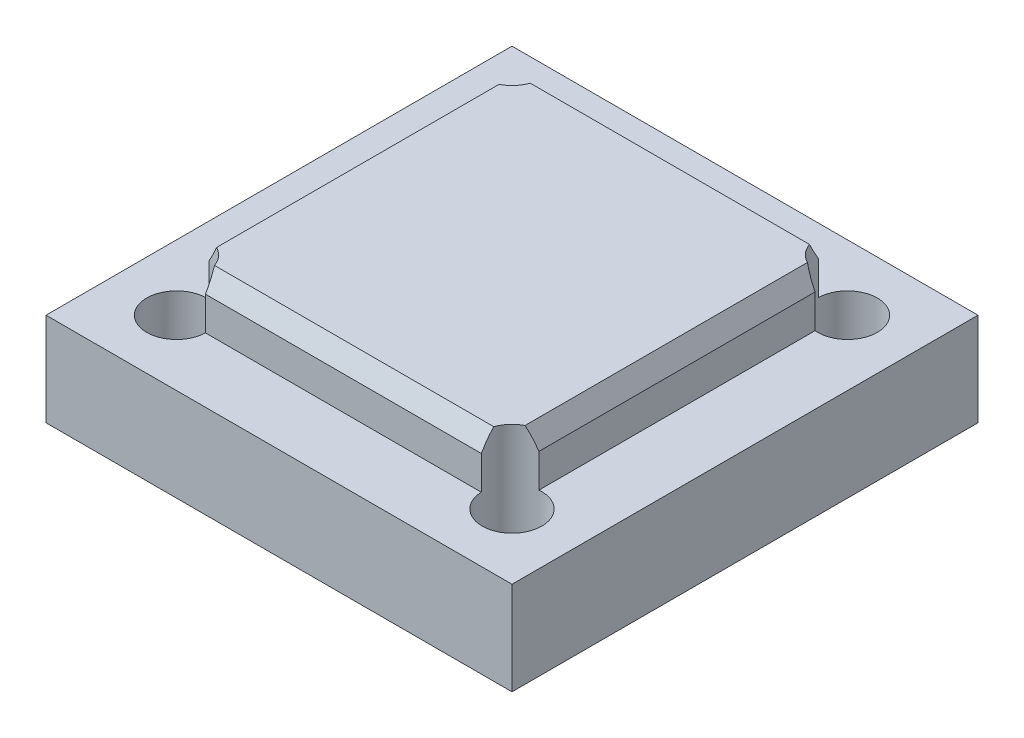
ISO-10303-21;
HEADER;
FILE_DESCRIPTION(('STEP AP214'),'2;1');
FILE_NAME('part.step','',(''),(''),'','','');
FILE_SCHEMA(('AUTOMOTIVE_DESIGN { 1 0 10303 214 1 1 1 1 }'));
ENDSEC;
DATA;
#1=APPLICATION_CONTEXT('core data for automotive mechanical design processes');
#2=APPLICATION_PROTOCOL_DEFINITION('international standard','automotive_design',2000,#1);
#3=PRODUCT_CONTEXT('',#1,'mechanical');
#4=PRODUCT('Part','Part','',(#3));
#5=PRODUCT_RELATED_PRODUCT_CATEGORY('part','',(#4));
#6=PRODUCT_DEFINITION_FORMATION('','',#4);
#7=PRODUCT_DEFINITION_CONTEXT('part definition',#1,'design');
#8=PRODUCT_DEFINITION('design','',#6,#7);
#9=PRODUCT_DEFINITION_SHAPE('','',#8);
#10=(LENGTH_UNIT() NAMED_UNIT(*) SI_UNIT(.MILLI.,.METRE.));
#11=(NAMED_UNIT(*) PLANE_ANGLE_UNIT() SI_UNIT($,.RADIAN.));
#12=(NAMED_UNIT(*) SI_UNIT($,.STERADIAN.) SOLID_ANGLE_UNIT());
#13=UNCERTAINTY_MEASURE_WITH_UNIT(LENGTH_MEASURE(1.E-05),#10,'distance_accuracy_value','');
#14=(GEOMETRIC_REPRESENTATION_CONTEXT(3) GLOBAL_UNCERTAINTY_ASSIGNED_CONTEXT((#13)) GLOBAL_UNIT_ASSIGNED_CONTEXT((#10,
#11,#12)) REPRESENTATION_CONTEXT('',''));
#15=CARTESIAN_POINT('',(0.,0.,0.));
#16=DIRECTION('',(0.,0.,1.));
#17=DIRECTION('',(1.,0.,0.));
#18=AXIS2_PLACEMENT_3D('',#15,#16,#17);
#19=CARTESIAN_POINT('',(0.,5.,0.));
#20=DIRECTION('',(0.,1.,0.));
#21=DIRECTION('',(0.,0.,1.));
#22=AXIS2_PLACEMENT_3D('',#19,#20,#21);
#23=PLANE('',#22);
#24=CARTESIAN_POINT('',(-9.,5.,9.));
#25=DIRECTION('',(0.,1.,0.));
#26=DIRECTION('',(0.,0.,1.));
#27=AXIS2_PLACEMENT_3D('',#24,#25,#26);
#28=CIRCLE('',#27,1.6);
#29=CARTESIAN_POINT('',(-8.84999999999999,5.,7.4070467677926));
#30=VERTEX_POINT('',#29);
#31=CARTESIAN_POINT('',(-7.40067118298047,5.,9.04633934668198));
#32=VERTEX_POINT('',#31);
#33=EDGE_CURVE('E283',#30,#32,#28,.T.);
#34=ORIENTED_EDGE('',*,*,#33,.F.);
#35=DIRECTION('',(0.,0.,1.));
#36=VECTOR('',#35,1.);
#37=CARTESIAN_POINT('',(-8.85,5.,-9.04633934668197));
#38=LINE('',#37,#36);
#39=CARTESIAN_POINT('',(-8.85,5.,-7.4070467677926));
#40=VERTEX_POINT('',#39);
#41=EDGE_CURVE('E300',#40,#30,#38,.T.);
#42=ORIENTED_EDGE('',*,*,#41,.F.);
#43=CARTESIAN_POINT('',(-9.,5.,-9.));
#44=DIRECTION('',(0.,1.,0.));
#45=DIRECTION('',(0.,0.,1.));
#46=AXIS2_PLACEMENT_3D('',#43,#44,#45);
#47=CIRCLE('',#46,1.6);
#48=CARTESIAN_POINT('',(-7.40067118298047,5.,-9.04633934668197));
#49=VERTEX_POINT('',#48);
#50=EDGE_CURVE('E173',#49,#40,#47,.T.);
#51=ORIENTED_EDGE('',*,*,#50,.F.);
#52=DIRECTION('',(-1.,0.,0.));
#53=VECTOR('',#52,1.);
#54=CARTESIAN_POINT('',(8.85,5.,-9.04633934668198));
#55=LINE('',#54,#53);
#56=CARTESIAN_POINT('',(7.40067118298047,5.,-9.04633934668198));
#57=VERTEX_POINT('',#56);
#58=EDGE_CURVE('E151',#57,#49,#55,.T.);
#59=ORIENTED_EDGE('',*,*,#58,.F.);
#60=CARTESIAN_POINT('',(9.,5.,-9.));
#61=DIRECTION('',(0.,1.,0.));
#62=DIRECTION('',(0.,0.,1.));
#63=AXIS2_PLACEMENT_3D('',#60,#61,#62);
#64=CIRCLE('',#63,1.6);
#65=CARTESIAN_POINT('',(8.85,5.,-7.4070467677926));
#66=VERTEX_POINT('',#65);
#67=EDGE_CURVE('E156',#66,#57,#64,.T.);
#68=ORIENTED_EDGE('',*,*,#67,.F.);
#69=DIRECTION('',(0.,0.,-1.));
#70=VECTOR('',#69,1.);
#71=CARTESIAN_POINT('',(8.85,5.,-9.04633934668198));
#72=LINE('',#71,#70);
#73=CARTESIAN_POINT('',(8.85,5.,7.4070467677926));
#74=VERTEX_POINT('',#73);
#75=EDGE_CURVE('E175',#74,#66,#72,.T.);
#76=ORIENTED_EDGE('',*,*,#75,.F.);
#77=CARTESIAN_POINT('',(9.,5.,9.));
#78=DIRECTION('',(0.,1.,0.));
#79=DIRECTION('',(0.,0.,1.));
#80=AXIS2_PLACEMENT_3D('',#77,#78,#79);
#81=CIRCLE('',#80,1.6);
#82=CARTESIAN_POINT('',(7.40067118298047,5.,9.04633934668198));
#83=VERTEX_POINT('',#82);
#84=EDGE_CURVE('E295',#83,#74,#81,.T.);
#85=ORIENTED_EDGE('',*,*,#84,.F.);
#86=DIRECTION('',(1.,0.,0.));
#87=VECTOR('',#86,1.);
#88=CARTESIAN_POINT('',(8.85,5.,9.04633934668198));
#89=LINE('',#88,#87);
#90=EDGE_CURVE('E180',#32,#83,#89,.T.);
#91=ORIENTED_EDGE('',*,*,#90,.F.);
#92=EDGE_LOOP('',(#34,#42,#51,#59,#68,#76,#85,#91));
#93=FACE_BOUND('',#92,.T.);
#94=DIRECTION('',(0.,0.,1.));
#95=VECTOR('',#94,1.);
#96=CARTESIAN_POINT('',(-12.5,5.,12.5));
#97=LINE('',#96,#95);
#98=CARTESIAN_POINT('',(-12.5,5.,-12.5));
#99=VERTEX_POINT('',#98);
#100=CARTESIAN_POINT('',(-12.5,5.,12.5));
#101=VERTEX_POINT('',#100);
#102=EDGE_CURVE('E184',#99,#101,#97,.T.);
#103=ORIENTED_EDGE('',*,*,#102,.T.);
#104=DIRECTION('',(1.,0.,0.));
#105=VECTOR('',#104,1.);
#106=CARTESIAN_POINT('',(12.5,5.,12.5));
#107=LINE('',#106,#105);
#108=CARTESIAN_POINT('',(12.5,5.,12.5));
#109=VERTEX_POINT('',#108);
#110=EDGE_CURVE('E187',#101,#109,#107,.T.);
#111=ORIENTED_EDGE('',*,*,#110,.T.);
#112=DIRECTION('',(0.,0.,-1.));
#113=VECTOR('',#112,1.);
#114=CARTESIAN_POINT('',(12.5,5.,12.5));
#115=LINE('',#114,#113);
#116=CARTESIAN_POINT('',(12.5,5.,-12.5));
#117=VERTEX_POINT('',#116);
#118=EDGE_CURVE('E190',#109,#117,#115,.T.);
#119=ORIENTED_EDGE('',*,*,#118,.T.);
#120=DIRECTION('',(-1.,0.,0.));
#121=VECTOR('',#120,1.);
#122=CARTESIAN_POINT('',(12.5,5.,-12.5));
#123=LINE('',#122,#121);
#124=EDGE_CURVE('E192',#117,#99,#123,.T.);
#125=ORIENTED_EDGE('',*,*,#124,.T.);
#126=EDGE_LOOP('',(#103,#111,#119,#125));
#127=FACE_BOUND('',#126,.T.);
#128=ADVANCED_FACE('F34',(#93,#127),#23,.T.);
#129=CARTESIAN_POINT('',(-12.5,5.,12.5));
#130=DIRECTION('',(1.,0.,0.));
#131=DIRECTION('',(0.,0.,-1.));
#132=AXIS2_PLACEMENT_3D('',#129,#130,#131);
#133=PLANE('',#132);
#134=DIRECTION('',(0.,0.,1.));
#135=VECTOR('',#134,1.);
#136=CARTESIAN_POINT('',(-12.5,0.,12.5));
#137=LINE('',#136,#135);
#138=CARTESIAN_POINT('',(-12.5,0.,-12.5));
#139=VERTEX_POINT('',#138);
#140=CARTESIAN_POINT('',(-12.5,0.,12.5));
#141=VERTEX_POINT('',#140);
#142=EDGE_CURVE('E174',#139,#141,#137,.T.);
#143=ORIENTED_EDGE('',*,*,#142,.T.);
#144=DIRECTION('',(0.,-1.,0.));
#145=VECTOR('',#144,1.);
#146=CARTESIAN_POINT('',(-12.5,5.,12.5));
#147=LINE('',#146,#145);
#148=EDGE_CURVE('E207',#101,#141,#147,.T.);
#149=ORIENTED_EDGE('',*,*,#148,.F.);
#150=ORIENTED_EDGE('',*,*,#102,.F.);
#151=DIRECTION('',(0.,-1.,0.));
#152=VECTOR('',#151,1.);
#153=CARTESIAN_POINT('',(-12.5,5.,-12.5));
#154=LINE('',#153,#152);
#155=EDGE_CURVE('E193',#99,#139,#154,.T.);
#156=ORIENTED_EDGE('',*,*,#155,.T.);
#157=EDGE_LOOP('',(#143,#149,#150,#156));
#158=FACE_BOUND('',#157,.T.);
#159=ADVANCED_FACE('F327',(#158),#133,.F.);
#160=CARTESIAN_POINT('',(12.5,5.,12.5));
#161=DIRECTION('',(0.,0.,-1.));
#162=DIRECTION('',(-1.,0.,0.));
#163=AXIS2_PLACEMENT_3D('',#160,#161,#162);
#164=PLANE('',#163);
#165=DIRECTION('',(1.,0.,0.));
#166=VECTOR('',#165,1.);
#167=CARTESIAN_POINT('',(12.5,0.,12.5));
#168=LINE('',#167,#166);
#169=CARTESIAN_POINT('',(12.5,0.,12.5));
#170=VERTEX_POINT('',#169);
#171=EDGE_CURVE('E178',#141,#170,#168,.T.);
#172=ORIENTED_EDGE('',*,*,#171,.T.);
#173=DIRECTION('',(0.,-1.,0.));
#174=VECTOR('',#173,1.);
#175=CARTESIAN_POINT('',(12.5,5.,12.5));
#176=LINE('',#175,#174);
#177=EDGE_CURVE('E204',#109,#170,#176,.T.);
#178=ORIENTED_EDGE('',*,*,#177,.F.);
#179=ORIENTED_EDGE('',*,*,#110,.F.);
#180=ORIENTED_EDGE('',*,*,#148,.T.);
#181=EDGE_LOOP('',(#172,#178,#179,#180));
#182=FACE_BOUND('',#181,.T.);
#183=ADVANCED_FACE('F332',(#182),#164,.F.);
#184=CARTESIAN_POINT('',(12.5,5.,12.5));
#185=DIRECTION('',(-1.,0.,0.));
#186=DIRECTION('',(0.,0.,1.));
#187=AXIS2_PLACEMENT_3D('',#184,#185,#186);
#188=PLANE('',#187);
#189=DIRECTION('',(0.,0.,-1.));
#190=VECTOR('',#189,1.);
#191=CARTESIAN_POINT('',(12.5,0.,12.5));
#192=LINE('',#191,#190);
#193=CARTESIAN_POINT('',(12.5,0.,-12.5));
#194=VERTEX_POINT('',#193);
#195=EDGE_CURVE('E196',#170,#194,#192,.T.);
#196=ORIENTED_EDGE('',*,*,#195,.T.);
#197=DIRECTION('',(0.,-1.,0.));
#198=VECTOR('',#197,1.);
#199=CARTESIAN_POINT('',(12.5,5.,-12.5));
#200=LINE('',#199,#198);
#201=EDGE_CURVE('E201',#117,#194,#200,.T.);
#202=ORIENTED_EDGE('',*,*,#201,.F.);
#203=ORIENTED_EDGE('',*,*,#118,.F.);
#204=ORIENTED_EDGE('',*,*,#177,.T.);
#205=EDGE_LOOP('',(#196,#202,#203,#204));
#206=FACE_BOUND('',#205,.T.);
#207=ADVANCED_FACE('F345',(#206),#188,.F.);
#208=CARTESIAN_POINT('',(12.5,5.,-12.5));
#209=DIRECTION('',(0.,0.,1.));
#210=DIRECTION('',(1.,0.,0.));
#211=AXIS2_PLACEMENT_3D('',#208,#209,#210);
#212=PLANE('',#211);
#213=DIRECTION('',(-1.,0.,0.));
#214=VECTOR('',#213,1.);
#215=CARTESIAN_POINT('',(12.5,0.,-12.5));
#216=LINE('',#215,#214);
#217=EDGE_CURVE('E188',#194,#139,#216,.T.);
#218=ORIENTED_EDGE('',*,*,#217,.T.);
#219=ORIENTED_EDGE('',*,*,#155,.F.);
#220=ORIENTED_EDGE('',*,*,#124,.F.);
#221=ORIENTED_EDGE('',*,*,#201,.T.);
#222=EDGE_LOOP('',(#218,#219,#220,#221));
#223=FACE_BOUND('',#222,.T.);
#224=ADVANCED_FACE('F341',(#223),#212,.F.);
#225=CARTESIAN_POINT('',(0.,0.,0.));
#226=DIRECTION('',(0.,1.,0.));
#227=DIRECTION('',(0.,0.,1.));
#228=AXIS2_PLACEMENT_3D('',#225,#226,#227);
#229=PLANE('',#228);
#230=CARTESIAN_POINT('',(-9.,0.,9.));
#231=DIRECTION('',(0.,1.,0.));
#232=DIRECTION('',(0.,0.,1.));
#233=AXIS2_PLACEMENT_3D('',#230,#231,#232);
#234=CIRCLE('',#233,1.6);
#235=CARTESIAN_POINT('',(-9.,0.,10.6));
#236=VERTEX_POINT('',#235);
#237=EDGE_CURVE('E157',#236,#236,#234,.T.);
#238=ORIENTED_EDGE('',*,*,#237,.T.);
#239=EDGE_LOOP('',(#238));
#240=FACE_BOUND('',#239,.T.);
#241=CARTESIAN_POINT('',(-9.,0.,-9.));
#242=DIRECTION('',(0.,1.,0.));
#243=DIRECTION('',(0.,0.,1.));
#244=AXIS2_PLACEMENT_3D('',#241,#242,#243);
#245=CIRCLE('',#244,1.6);
#246=CARTESIAN_POINT('',(-9.,0.,-7.4));
#247=VERTEX_POINT('',#246);
#248=EDGE_CURVE('E265',#247,#247,#245,.T.);
#249=ORIENTED_EDGE('',*,*,#248,.T.);
#250=EDGE_LOOP('',(#249));
#251=FACE_BOUND('',#250,.T.);
#252=CARTESIAN_POINT('',(9.,0.,-9.));
#253=DIRECTION('',(0.,1.,0.));
#254=DIRECTION('',(0.,0.,1.));
#255=AXIS2_PLACEMENT_3D('',#252,#253,#254);
#256=CIRCLE('',#255,1.6);
#257=CARTESIAN_POINT('',(9.,0.,-7.4));
#258=VERTEX_POINT('',#257);
#259=EDGE_CURVE('E272',#258,#258,#256,.T.);
#260=ORIENTED_EDGE('',*,*,#259,.T.);
#261=EDGE_LOOP('',(#260));
#262=FACE_BOUND('',#261,.T.);
#263=CARTESIAN_POINT('',(9.,0.,9.));
#264=DIRECTION('',(0.,1.,0.));
#265=DIRECTION('',(0.,0.,1.));
#266=AXIS2_PLACEMENT_3D('',#263,#264,#265);
#267=CIRCLE('',#266,1.6);
#268=CARTESIAN_POINT('',(9.,0.,10.6));
#269=VERTEX_POINT('',#268);
#270=EDGE_CURVE('E290',#269,#269,#267,.T.);
#271=ORIENTED_EDGE('',*,*,#270,.T.);
#272=EDGE_LOOP('',(#271));
#273=FACE_BOUND('',#272,.T.);
#274=ORIENTED_EDGE('',*,*,#142,.F.);
#275=ORIENTED_EDGE('',*,*,#217,.F.);
#276=ORIENTED_EDGE('',*,*,#195,.F.);
#277=ORIENTED_EDGE('',*,*,#171,.F.);
#278=EDGE_LOOP('',(#274,#275,#276,#277));
#279=FACE_BOUND('',#278,.T.);
#280=ADVANCED_FACE('F338',(#240,#251,#262,#273,#279),#229,.F.);
#281=CARTESIAN_POINT('',(-8.85,7.8,-9.04633934668197));
#282=DIRECTION('',(1.,0.,0.));
#283=DIRECTION('',(0.,0.,-1.));
#284=AXIS2_PLACEMENT_3D('',#281,#282,#283);
#285=PLANE('',#284);
#286=DIRECTION('',(0.,1.,0.));
#287=VECTOR('',#286,1.);
#288=CARTESIAN_POINT('',(-8.84999999999999,0.,7.4070467677926));
#289=LINE('',#288,#287);
#290=CARTESIAN_POINT('',(-8.84999999999999,6.79999999999999,7.4070467677926));
#291=VERTEX_POINT('',#290);
#292=EDGE_CURVE('E245',#30,#291,#289,.T.);
#293=ORIENTED_EDGE('',*,*,#292,.T.);
#294=DIRECTION('',(0.,0.,-1.));
#295=VECTOR('',#294,1.);
#296=CARTESIAN_POINT('',(-8.85,6.79999999999999,-9.04633934668197));
#297=LINE('',#296,#295);
#298=CARTESIAN_POINT('',(-8.85,6.79999999999999,-7.4070467677926));
#299=VERTEX_POINT('',#298);
#300=EDGE_CURVE('E42',#291,#299,#297,.T.);
#301=ORIENTED_EDGE('',*,*,#300,.T.);
#302=DIRECTION('',(0.,1.,0.));
#303=VECTOR('',#302,1.);
#304=CARTESIAN_POINT('',(-8.85,0.,-7.4070467677926));
#305=LINE('',#304,#303);
#306=EDGE_CURVE('E244',#299,#40,#305,.F.);
#307=ORIENTED_EDGE('',*,*,#306,.T.);
#308=ORIENTED_EDGE('',*,*,#41,.T.);
#309=EDGE_LOOP('',(#293,#301,#307,#308));
#310=FACE_BOUND('',#309,.T.);
#311=ADVANCED_FACE('F242',(#310),#285,.F.);
#312=CARTESIAN_POINT('',(8.85,7.8,9.04633934668198));
#313=DIRECTION('',(0.,0.,-1.));
#314=DIRECTION('',(-1.,0.,0.));
#315=AXIS2_PLACEMENT_3D('',#312,#313,#314);
#316=PLANE('',#315);
#317=DIRECTION('',(0.,1.,0.));
#318=VECTOR('',#317,1.);
#319=CARTESIAN_POINT('',(7.40067118298047,0.,9.04633934668198));
#320=LINE('',#319,#318);
#321=CARTESIAN_POINT('',(7.40067118298047,6.79999999999999,9.04633934668198));
#322=VERTEX_POINT('',#321);
#323=EDGE_CURVE('E298',#83,#322,#320,.T.);
#324=ORIENTED_EDGE('',*,*,#323,.T.);
#325=DIRECTION('',(-1.,0.,0.));
#326=VECTOR('',#325,1.);
#327=CARTESIAN_POINT('',(8.85,6.79999999999999,9.04633934668198));
#328=LINE('',#327,#326);
#329=CARTESIAN_POINT('',(-7.40067118298047,6.79999999999999,9.04633934668198));
#330=VERTEX_POINT('',#329);
#331=EDGE_CURVE('E11',#322,#330,#328,.T.);
#332=ORIENTED_EDGE('',*,*,#331,.T.);
#333=DIRECTION('',(0.,1.,0.));
#334=VECTOR('',#333,1.);
#335=CARTESIAN_POINT('',(-7.40067118298047,0.,9.04633934668198));
#336=LINE('',#335,#334);
#337=EDGE_CURVE('E252',#330,#32,#336,.F.);
#338=ORIENTED_EDGE('',*,*,#337,.T.);
#339=ORIENTED_EDGE('',*,*,#90,.T.);
#340=EDGE_LOOP('',(#324,#332,#338,#339));
#341=FACE_BOUND('',#340,.T.);
#342=ADVANCED_FACE('F303',(#341),#316,.F.);
#343=CARTESIAN_POINT('',(8.85,7.8,-9.04633934668198));
#344=DIRECTION('',(-1.,0.,0.));
#345=DIRECTION('',(0.,0.,1.));
#346=AXIS2_PLACEMENT_3D('',#343,#344,#345);
#347=PLANE('',#346);
#348=DIRECTION('',(0.,1.,0.));
#349=VECTOR('',#348,1.);
#350=CARTESIAN_POINT('',(8.85,0.,-7.4070467677926));
#351=LINE('',#350,#349);
#352=CARTESIAN_POINT('',(8.85,6.79999999999999,-7.4070467677926));
#353=VERTEX_POINT('',#352);
#354=EDGE_CURVE('E163',#66,#353,#351,.T.);
#355=ORIENTED_EDGE('',*,*,#354,.T.);
#356=DIRECTION('',(0.,0.,1.));
#357=VECTOR('',#356,1.);
#358=CARTESIAN_POINT('',(8.85,6.79999999999999,-9.04633934668198));
#359=LINE('',#358,#357);
#360=CARTESIAN_POINT('',(8.85,6.79999999999999,7.4070467677926));
#361=VERTEX_POINT('',#360);
#362=EDGE_CURVE('E226',#353,#361,#359,.T.);
#363=ORIENTED_EDGE('',*,*,#362,.T.);
#364=DIRECTION('',(0.,1.,0.));
#365=VECTOR('',#364,1.);
#366=CARTESIAN_POINT('',(8.85,0.,7.4070467677926));
#367=LINE('',#366,#365);
#368=EDGE_CURVE('E293',#361,#74,#367,.F.);
#369=ORIENTED_EDGE('',*,*,#368,.T.);
#370=ORIENTED_EDGE('',*,*,#75,.T.);
#371=EDGE_LOOP('',(#355,#363,#369,#370));
#372=FACE_BOUND('',#371,.T.);
#373=ADVANCED_FACE('F309',(#372),#347,.F.);
#374=CARTESIAN_POINT('',(8.85,7.8,-9.04633934668198));
#375=DIRECTION('',(0.,0.,1.));
#376=DIRECTION('',(1.,0.,0.));
#377=AXIS2_PLACEMENT_3D('',#374,#375,#376);
#378=PLANE('',#377);
#379=DIRECTION('',(0.,1.,0.));
#380=VECTOR('',#379,1.);
#381=CARTESIAN_POINT('',(-7.40067118298047,0.,-9.04633934668197));
#382=LINE('',#381,#380);
#383=CARTESIAN_POINT('',(-7.40067118298047,6.8,-9.04633934668197));
#384=VERTEX_POINT('',#383);
#385=EDGE_CURVE('E279',#49,#384,#382,.T.);
#386=ORIENTED_EDGE('',*,*,#385,.T.);
#387=DIRECTION('',(1.,0.,0.));
#388=VECTOR('',#387,1.);
#389=CARTESIAN_POINT('',(8.85,6.8,-9.04633934668198));
#390=LINE('',#389,#388);
#391=CARTESIAN_POINT('',(7.40067118298047,6.8,-9.04633934668198));
#392=VERTEX_POINT('',#391);
#393=EDGE_CURVE('E153',#384,#392,#390,.T.);
#394=ORIENTED_EDGE('',*,*,#393,.T.);
#395=DIRECTION('',(0.,1.,0.));
#396=VECTOR('',#395,1.);
#397=CARTESIAN_POINT('',(7.40067118298047,0.,-9.04633934668198));
#398=LINE('',#397,#396);
#399=EDGE_CURVE('E146',#392,#57,#398,.F.);
#400=ORIENTED_EDGE('',*,*,#399,.T.);
#401=ORIENTED_EDGE('',*,*,#58,.T.);
#402=EDGE_LOOP('',(#386,#394,#400,#401));
#403=FACE_BOUND('',#402,.T.);
#404=ADVANCED_FACE('F149',(#403),#378,.F.);
#405=CARTESIAN_POINT('',(0.,7.8,0.));
#406=DIRECTION('',(0.,-1.,0.));
#407=DIRECTION('',(0.,0.,-1.));
#408=AXIS2_PLACEMENT_3D('',#405,#406,#407);
#409=PLANE('',#408);
#410=CARTESIAN_POINT('',(9.,7.8,9.));
#411=DIRECTION('',(0.,1.,0.));
#412=DIRECTION('',(0.,0.,1.));
#413=AXIS2_PLACEMENT_3D('',#410,#411,#412);
#414=CIRCLE('',#413,1.6);
#415=CARTESIAN_POINT('',(8.27264973081038,7.8,7.57488190457429));
#416=VERTEX_POINT('',#415);
#417=CARTESIAN_POINT('',(7.49068644736172,7.8,8.46898907749235));
#418=VERTEX_POINT('',#417);
#419=EDGE_CURVE('E287',#416,#418,#414,.T.);
#420=ORIENTED_EDGE('',*,*,#419,.F.);
#421=DIRECTION('',(0.,0.,-1.));
#422=VECTOR('',#421,1.);
#423=CARTESIAN_POINT('',(8.27264973081038,7.8,0.));
#424=LINE('',#423,#422);
#425=CARTESIAN_POINT('',(8.27264973081038,7.8,-7.5748819045743));
#426=VERTEX_POINT('',#425);
#427=EDGE_CURVE('E219',#416,#426,#424,.T.);
#428=ORIENTED_EDGE('',*,*,#427,.T.);
#429=CARTESIAN_POINT('',(9.,7.8,-9.));
#430=DIRECTION('',(0.,1.,0.));
#431=DIRECTION('',(0.,0.,1.));
#432=AXIS2_PLACEMENT_3D('',#429,#430,#431);
#433=CIRCLE('',#432,1.6);
#434=CARTESIAN_POINT('',(7.49068644736172,7.8,-8.46898907749235));
#435=VERTEX_POINT('',#434);
#436=EDGE_CURVE('E274',#435,#426,#433,.T.);
#437=ORIENTED_EDGE('',*,*,#436,.F.);
#438=DIRECTION('',(-1.,0.,0.));
#439=VECTOR('',#438,1.);
#440=CARTESIAN_POINT('',(0.,7.8,-8.46898907749235));
#441=LINE('',#440,#439);
#442=CARTESIAN_POINT('',(-7.49068644736172,7.8,-8.46898907749235));
#443=VERTEX_POINT('',#442);
#444=EDGE_CURVE('E216',#435,#443,#441,.T.);
#445=ORIENTED_EDGE('',*,*,#444,.T.);
#446=CARTESIAN_POINT('',(-9.,7.8,-9.));
#447=DIRECTION('',(0.,1.,0.));
#448=DIRECTION('',(0.,0.,1.));
#449=AXIS2_PLACEMENT_3D('',#446,#447,#448);
#450=CIRCLE('',#449,1.6);
#451=CARTESIAN_POINT('',(-8.27264973081037,7.8,-7.5748819045743));
#452=VERTEX_POINT('',#451);
#453=EDGE_CURVE('E262',#452,#443,#450,.T.);
#454=ORIENTED_EDGE('',*,*,#453,.F.);
#455=DIRECTION('',(0.,0.,1.));
#456=VECTOR('',#455,1.);
#457=CARTESIAN_POINT('',(-8.27264973081037,7.8,0.));
#458=LINE('',#457,#456);
#459=CARTESIAN_POINT('',(-8.27264973081037,7.8,7.57488190457429));
#460=VERTEX_POINT('',#459);
#461=EDGE_CURVE('E213',#452,#460,#458,.T.);
#462=ORIENTED_EDGE('',*,*,#461,.T.);
#463=CARTESIAN_POINT('',(-9.,7.8,9.));
#464=DIRECTION('',(0.,1.,0.));
#465=DIRECTION('',(0.,0.,1.));
#466=AXIS2_PLACEMENT_3D('',#463,#464,#465);
#467=CIRCLE('',#466,1.6);
#468=CARTESIAN_POINT('',(-7.49068644736172,7.8,8.46898907749235));
#469=VERTEX_POINT('',#468);
#470=EDGE_CURVE('E260',#469,#460,#467,.T.);
#471=ORIENTED_EDGE('',*,*,#470,.F.);
#472=DIRECTION('',(1.,0.,0.));
#473=VECTOR('',#472,1.);
#474=CARTESIAN_POINT('',(0.,7.8,8.46898907749235));
#475=LINE('',#474,#473);
#476=EDGE_CURVE('E210',#469,#418,#475,.T.);
#477=ORIENTED_EDGE('',*,*,#476,.T.);
#478=EDGE_LOOP('',(#420,#428,#437,#445,#454,#462,#471,#477));
#479=FACE_BOUND('',#478,.T.);
#480=ADVANCED_FACE('F259',(#479),#409,.F.);
#481=CARTESIAN_POINT('',(9.,0.,9.));
#482=DIRECTION('',(0.,1.,0.));
#483=DIRECTION('',(0.,0.,1.));
#484=AXIS2_PLACEMENT_3D('',#481,#482,#483);
#485=CYLINDRICAL_SURFACE('',#484,1.6);
#486=ORIENTED_EDGE('',*,*,#270,.F.);
#487=EDGE_LOOP('',(#486));
#488=FACE_BOUND('',#487,.T.);
#489=ORIENTED_EDGE('',*,*,#368,.F.);
#490=CARTESIAN_POINT('',(9.,6.54019237886467,9.));
#491=DIRECTION('',(-0.86602540378444,-0.499999999999997,0.));
#492=DIRECTION('',(-0.499999999999997,0.86602540378444,0.));
#493=AXIS2_PLACEMENT_3D('',#490,#491,#492);
#494=ELLIPSE('',#493,3.20000000000002,1.6);
#495=EDGE_CURVE('E230',#361,#416,#494,.F.);
#496=ORIENTED_EDGE('',*,*,#495,.T.);
#497=ORIENTED_EDGE('',*,*,#419,.T.);
#498=CARTESIAN_POINT('',(9.,6.88026210284273,9.));
#499=DIRECTION('',(0.,-0.499999999999997,-0.86602540378444));
#500=DIRECTION('',(0.,0.86602540378444,-0.499999999999997));
#501=AXIS2_PLACEMENT_3D('',#498,#499,#500);
#502=ELLIPSE('',#501,3.20000000000002,1.6);
#503=EDGE_CURVE('E228',#418,#322,#502,.F.);
#504=ORIENTED_EDGE('',*,*,#503,.T.);
#505=ORIENTED_EDGE('',*,*,#323,.F.);
#506=ORIENTED_EDGE('',*,*,#84,.T.);
#507=EDGE_LOOP('',(#489,#496,#497,#504,#505,#506));
#508=FACE_BOUND('',#507,.T.);
#509=ADVANCED_FACE('F307',(#488,#508),#485,.F.);
#510=CARTESIAN_POINT('',(9.,0.,-9.));
#511=DIRECTION('',(0.,1.,0.));
#512=DIRECTION('',(0.,0.,1.));
#513=AXIS2_PLACEMENT_3D('',#510,#511,#512);
#514=CYLINDRICAL_SURFACE('',#513,1.6);
#515=ORIENTED_EDGE('',*,*,#259,.F.);
#516=EDGE_LOOP('',(#515));
#517=FACE_BOUND('',#516,.T.);
#518=ORIENTED_EDGE('',*,*,#436,.T.);
#519=CARTESIAN_POINT('',(9.,6.54019237886467,-9.));
#520=DIRECTION('',(-0.86602540378444,-0.499999999999997,0.));
#521=DIRECTION('',(-0.499999999999997,0.86602540378444,0.));
#522=AXIS2_PLACEMENT_3D('',#519,#520,#521);
#523=ELLIPSE('',#522,3.20000000000002,1.6);
#524=EDGE_CURVE('E224',#426,#353,#523,.F.);
#525=ORIENTED_EDGE('',*,*,#524,.T.);
#526=ORIENTED_EDGE('',*,*,#354,.F.);
#527=ORIENTED_EDGE('',*,*,#67,.T.);
#528=ORIENTED_EDGE('',*,*,#399,.F.);
#529=CARTESIAN_POINT('',(9.,6.88026210284273,-9.));
#530=DIRECTION('',(0.,-0.499999999999998,0.86602540378444));
#531=DIRECTION('',(0.,0.86602540378444,0.499999999999998));
#532=AXIS2_PLACEMENT_3D('',#529,#530,#531);
#533=ELLIPSE('',#532,3.20000000000002,1.6);
#534=EDGE_CURVE('E222',#392,#435,#533,.F.);
#535=ORIENTED_EDGE('',*,*,#534,.T.);
#536=EDGE_LOOP('',(#518,#525,#526,#527,#528,#535));
#537=FACE_BOUND('',#536,.T.);
#538=ADVANCED_FACE('F161',(#517,#537),#514,.F.);
#539=CARTESIAN_POINT('',(-9.,0.,-9.));
#540=DIRECTION('',(0.,1.,0.));
#541=DIRECTION('',(0.,0.,1.));
#542=AXIS2_PLACEMENT_3D('',#539,#540,#541);
#543=CYLINDRICAL_SURFACE('',#542,1.6);
#544=ORIENTED_EDGE('',*,*,#248,.F.);
#545=EDGE_LOOP('',(#544));
#546=FACE_BOUND('',#545,.T.);
#547=ORIENTED_EDGE('',*,*,#453,.T.);
#548=CARTESIAN_POINT('',(-9.,6.88026210284272,-9.));
#549=DIRECTION('',(0.,-0.499999999999998,0.86602540378444));
#550=DIRECTION('',(0.,0.86602540378444,0.499999999999998));
#551=AXIS2_PLACEMENT_3D('',#548,#549,#550);
#552=ELLIPSE('',#551,3.20000000000002,1.6);
#553=EDGE_CURVE('E234',#443,#384,#552,.F.);
#554=ORIENTED_EDGE('',*,*,#553,.T.);
#555=ORIENTED_EDGE('',*,*,#385,.F.);
#556=ORIENTED_EDGE('',*,*,#50,.T.);
#557=ORIENTED_EDGE('',*,*,#306,.F.);
#558=CARTESIAN_POINT('',(-9.,6.54019237886465,-9.));
#559=DIRECTION('',(0.86602540378444,-0.499999999999997,0.));
#560=DIRECTION('',(0.499999999999997,0.86602540378444,0.));
#561=AXIS2_PLACEMENT_3D('',#558,#559,#560);
#562=ELLIPSE('',#561,3.20000000000002,1.6);
#563=EDGE_CURVE('E232',#299,#452,#562,.F.);
#564=ORIENTED_EDGE('',*,*,#563,.T.);
#565=EDGE_LOOP('',(#547,#554,#555,#556,#557,#564));
#566=FACE_BOUND('',#565,.T.);
#567=ADVANCED_FACE('F250',(#546,#566),#543,.F.);
#568=CARTESIAN_POINT('',(-9.,0.,9.));
#569=DIRECTION('',(0.,1.,0.));
#570=DIRECTION('',(0.,0.,1.));
#571=AXIS2_PLACEMENT_3D('',#568,#569,#570);
#572=CYLINDRICAL_SURFACE('',#571,1.6);
#573=ORIENTED_EDGE('',*,*,#237,.F.);
#574=EDGE_LOOP('',(#573));
#575=FACE_BOUND('',#574,.T.);
#576=ORIENTED_EDGE('',*,*,#470,.T.);
#577=CARTESIAN_POINT('',(-9.,6.54019237886465,9.));
#578=DIRECTION('',(0.86602540378444,-0.499999999999997,0.));
#579=DIRECTION('',(0.499999999999997,0.86602540378444,0.));
#580=AXIS2_PLACEMENT_3D('',#577,#578,#579);
#581=ELLIPSE('',#580,3.20000000000002,1.6);
#582=EDGE_CURVE('E49',#460,#291,#581,.F.);
#583=ORIENTED_EDGE('',*,*,#582,.T.);
#584=ORIENTED_EDGE('',*,*,#292,.F.);
#585=ORIENTED_EDGE('',*,*,#33,.T.);
#586=ORIENTED_EDGE('',*,*,#337,.F.);
#587=CARTESIAN_POINT('',(-9.,6.88026210284273,9.));
#588=DIRECTION('',(0.,-0.499999999999997,-0.86602540378444));
#589=DIRECTION('',(0.,0.86602540378444,-0.499999999999997));
#590=AXIS2_PLACEMENT_3D('',#587,#588,#589);
#591=ELLIPSE('',#590,3.20000000000002,1.6);
#592=EDGE_CURVE('E237',#330,#469,#591,.F.);
#593=ORIENTED_EDGE('',*,*,#592,.T.);
#594=EDGE_LOOP('',(#576,#583,#584,#585,#586,#593));
#595=FACE_BOUND('',#594,.T.);
#596=ADVANCED_FACE('F263',(#575,#595),#572,.F.);
#597=CARTESIAN_POINT('',(8.27264973081038,7.8,0.));
#598=DIRECTION('',(-0.86602540378444,-0.499999999999997,0.));
#599=DIRECTION('',(0.,0.,-1.));
#600=AXIS2_PLACEMENT_3D('',#597,#598,#599);
#601=PLANE('',#600);
#602=ORIENTED_EDGE('',*,*,#495,.F.);
#603=ORIENTED_EDGE('',*,*,#362,.F.);
#604=ORIENTED_EDGE('',*,*,#524,.F.);
#605=ORIENTED_EDGE('',*,*,#427,.F.);
#606=EDGE_LOOP('',(#602,#603,#604,#605));
#607=FACE_BOUND('',#606,.T.);
#608=ADVANCED_FACE('F314',(#607),#601,.F.);
#609=CARTESIAN_POINT('',(0.,7.8,-8.46898907749235));
#610=DIRECTION('',(0.,-0.499999999999998,0.86602540378444));
#611=DIRECTION('',(-1.,0.,0.));
#612=AXIS2_PLACEMENT_3D('',#609,#610,#611);
#613=PLANE('',#612);
#614=ORIENTED_EDGE('',*,*,#534,.F.);
#615=ORIENTED_EDGE('',*,*,#393,.F.);
#616=ORIENTED_EDGE('',*,*,#553,.F.);
#617=ORIENTED_EDGE('',*,*,#444,.F.);
#618=EDGE_LOOP('',(#614,#615,#616,#617));
#619=FACE_BOUND('',#618,.T.);
#620=ADVANCED_FACE('F318',(#619),#613,.F.);
#621=CARTESIAN_POINT('',(-8.27264973081037,7.8,0.));
#622=DIRECTION('',(0.86602540378444,-0.499999999999997,0.));
#623=DIRECTION('',(0.,0.,1.));
#624=AXIS2_PLACEMENT_3D('',#621,#622,#623);
#625=PLANE('',#624);
#626=ORIENTED_EDGE('',*,*,#563,.F.);
#627=ORIENTED_EDGE('',*,*,#300,.F.);
#628=ORIENTED_EDGE('',*,*,#582,.F.);
#629=ORIENTED_EDGE('',*,*,#461,.F.);
#630=EDGE_LOOP('',(#626,#627,#628,#629));
#631=FACE_BOUND('',#630,.T.);
#632=ADVANCED_FACE('F255',(#631),#625,.F.);
#633=CARTESIAN_POINT('',(0.,7.8,8.46898907749235));
#634=DIRECTION('',(0.,-0.499999999999997,-0.86602540378444));
#635=DIRECTION('',(1.,0.,0.));
#636=AXIS2_PLACEMENT_3D('',#633,#634,#635);
#637=PLANE('',#636);
#638=ORIENTED_EDGE('',*,*,#592,.F.);
#639=ORIENTED_EDGE('',*,*,#331,.F.);
#640=ORIENTED_EDGE('',*,*,#503,.F.);
#641=ORIENTED_EDGE('',*,*,#476,.F.);
#642=EDGE_LOOP('',(#638,#639,#640,#641));
#643=FACE_BOUND('',#642,.T.);
#644=ADVANCED_FACE('F36',(#643),#637,.F.);
#645=CLOSED_SHELL('',(#128,#159,#183,#207,#224,#280,#311,#342,#373,#404,#480,#509,#538,#567,
#596,#608,#620,#632,#644));
#646=MANIFOLD_SOLID_BREP('B2',#645);
#647=ADVANCED_BREP_SHAPE_REPRESENTATION('',(#18,#646),#14);
#648=SHAPE_DEFINITION_REPRESENTATION(#9,#647);
ENDSEC;
END-ISO-10303-21;
